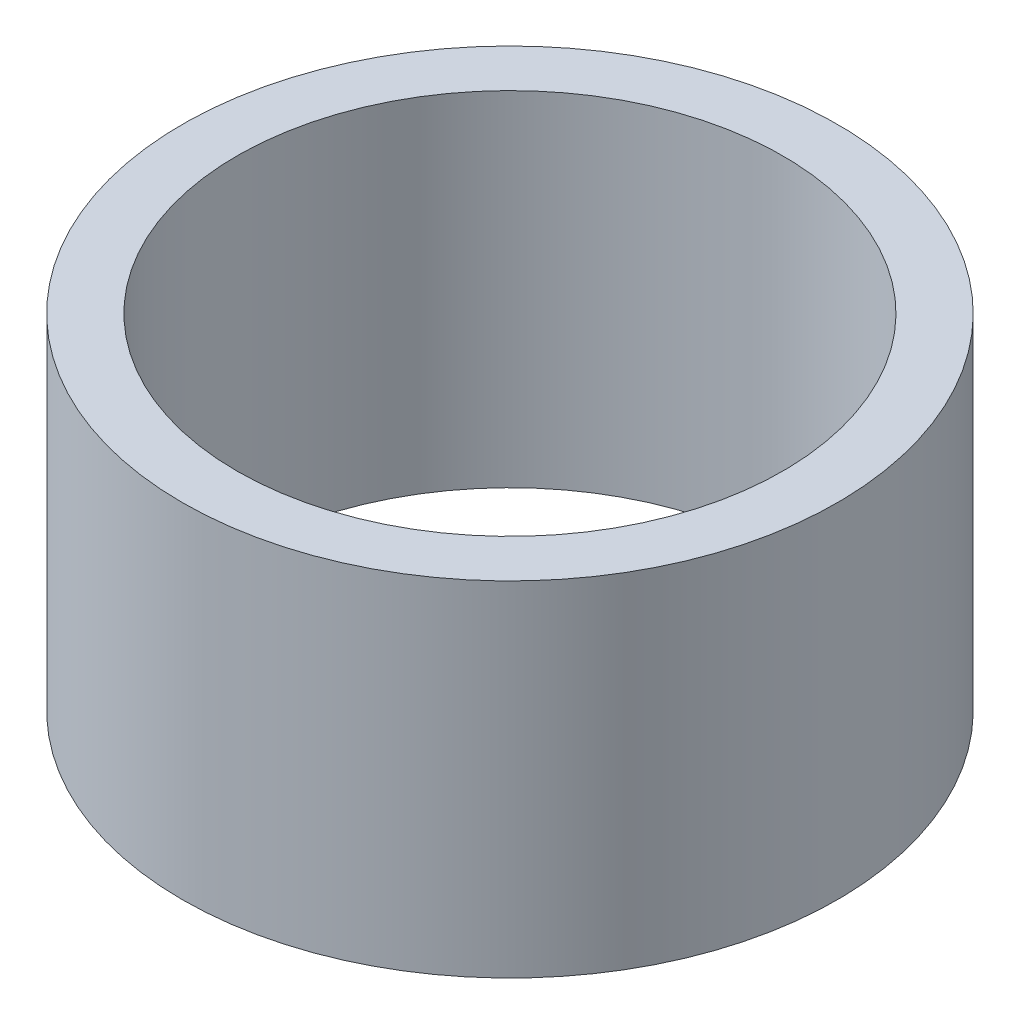
ISO-10303-21;
HEADER;
FILE_DESCRIPTION(('STEP AP214'),'2;1');
FILE_NAME('part.step','',(''),(''),'','','');
FILE_SCHEMA(('AUTOMOTIVE_DESIGN { 1 0 10303 214 1 1 1 1 }'));
ENDSEC;
DATA;
#1=APPLICATION_CONTEXT('core data for automotive mechanical design processes');
#2=APPLICATION_PROTOCOL_DEFINITION('international standard','automotive_design',2000,#1);
#3=PRODUCT_CONTEXT('',#1,'mechanical');
#4=PRODUCT('Part','Part','',(#3));
#5=PRODUCT_RELATED_PRODUCT_CATEGORY('part','',(#4));
#6=PRODUCT_DEFINITION_FORMATION('','',#4);
#7=PRODUCT_DEFINITION_CONTEXT('part definition',#1,'design');
#8=PRODUCT_DEFINITION('design','',#6,#7);
#9=PRODUCT_DEFINITION_SHAPE('','',#8);
#10=(LENGTH_UNIT() NAMED_UNIT(*) SI_UNIT(.MILLI.,.METRE.));
#11=(NAMED_UNIT(*) PLANE_ANGLE_UNIT() SI_UNIT($,.RADIAN.));
#12=(NAMED_UNIT(*) SI_UNIT($,.STERADIAN.) SOLID_ANGLE_UNIT());
#13=UNCERTAINTY_MEASURE_WITH_UNIT(LENGTH_MEASURE(1.E-05),#10,'distance_accuracy_value','');
#14=(GEOMETRIC_REPRESENTATION_CONTEXT(3) GLOBAL_UNCERTAINTY_ASSIGNED_CONTEXT((#13)) GLOBAL_UNIT_ASSIGNED_CONTEXT((#10,
#11,#12)) REPRESENTATION_CONTEXT('',''));
#15=CARTESIAN_POINT('',(0.,0.,0.));
#16=DIRECTION('',(0.,0.,1.));
#17=DIRECTION('',(1.,0.,0.));
#18=AXIS2_PLACEMENT_3D('',#15,#16,#17);
#19=CARTESIAN_POINT('',(0.,5.,0.));
#20=DIRECTION('',(0.,1.,0.));
#21=DIRECTION('',(0.,0.,1.));
#22=AXIS2_PLACEMENT_3D('',#19,#20,#21);
#23=PLANE('',#22);
#24=CARTESIAN_POINT('',(0.,5.,0.));
#25=DIRECTION('',(0.,1.,0.));
#26=DIRECTION('',(0.,0.,1.));
#27=AXIS2_PLACEMENT_3D('',#24,#25,#26);
#28=CIRCLE('',#27,4.7625);
#29=CARTESIAN_POINT('',(0.,5.,4.7625));
#30=VERTEX_POINT('',#29);
#31=EDGE_CURVE('E10',#30,#30,#28,.T.);
#32=ORIENTED_EDGE('',*,*,#31,.T.);
#33=EDGE_LOOP('',(#32));
#34=FACE_BOUND('',#33,.T.);
#35=CARTESIAN_POINT('',(0.,5.,0.));
#36=DIRECTION('',(0.,1.,0.));
#37=DIRECTION('',(0.,0.,1.));
#38=AXIS2_PLACEMENT_3D('',#35,#36,#37);
#39=CIRCLE('',#38,3.96875);
#40=CARTESIAN_POINT('',(0.,5.,3.96875));
#41=VERTEX_POINT('',#40);
#42=EDGE_CURVE('E50',#41,#41,#39,.T.);
#43=ORIENTED_EDGE('',*,*,#42,.F.);
#44=EDGE_LOOP('',(#43));
#45=FACE_BOUND('',#44,.T.);
#46=ADVANCED_FACE('F37',(#34,#45),#23,.T.);
#47=CARTESIAN_POINT('',(0.,0.,0.));
#48=DIRECTION('',(0.,1.,0.));
#49=DIRECTION('',(0.,0.,1.));
#50=AXIS2_PLACEMENT_3D('',#47,#48,#49);
#51=PLANE('',#50);
#52=CARTESIAN_POINT('',(0.,0.,0.));
#53=DIRECTION('',(0.,1.,0.));
#54=DIRECTION('',(0.,0.,1.));
#55=AXIS2_PLACEMENT_3D('',#52,#53,#54);
#56=CIRCLE('',#55,4.7625);
#57=CARTESIAN_POINT('',(0.,0.,4.7625));
#58=VERTEX_POINT('',#57);
#59=EDGE_CURVE('E41',#58,#58,#56,.T.);
#60=ORIENTED_EDGE('',*,*,#59,.F.);
#61=EDGE_LOOP('',(#60));
#62=FACE_BOUND('',#61,.T.);
#63=CARTESIAN_POINT('',(0.,0.,0.));
#64=DIRECTION('',(0.,1.,0.));
#65=DIRECTION('',(0.,0.,1.));
#66=AXIS2_PLACEMENT_3D('',#63,#64,#65);
#67=CIRCLE('',#66,3.96875);
#68=CARTESIAN_POINT('',(0.,0.,3.96875));
#69=VERTEX_POINT('',#68);
#70=EDGE_CURVE('E52',#69,#69,#67,.T.);
#71=ORIENTED_EDGE('',*,*,#70,.T.);
#72=EDGE_LOOP('',(#71));
#73=FACE_BOUND('',#72,.T.);
#74=ADVANCED_FACE('F64',(#62,#73),#51,.F.);
#75=CARTESIAN_POINT('',(0.,5.,0.));
#76=DIRECTION('',(0.,-1.,0.));
#77=DIRECTION('',(0.,0.,-1.));
#78=AXIS2_PLACEMENT_3D('',#75,#76,#77);
#79=CYLINDRICAL_SURFACE('',#78,4.7625);
#80=ORIENTED_EDGE('',*,*,#31,.F.);
#81=EDGE_LOOP('',(#80));
#82=FACE_BOUND('',#81,.T.);
#83=ORIENTED_EDGE('',*,*,#59,.T.);
#84=EDGE_LOOP('',(#83));
#85=FACE_BOUND('',#84,.T.);
#86=ADVANCED_FACE('F39',(#82,#85),#79,.T.);
#87=CARTESIAN_POINT('',(0.,5.,0.));
#88=DIRECTION('',(0.,-1.,0.));
#89=DIRECTION('',(0.,0.,-1.));
#90=AXIS2_PLACEMENT_3D('',#87,#88,#89);
#91=CYLINDRICAL_SURFACE('',#90,3.96875);
#92=ORIENTED_EDGE('',*,*,#42,.T.);
#93=EDGE_LOOP('',(#92));
#94=FACE_BOUND('',#93,.T.);
#95=ORIENTED_EDGE('',*,*,#70,.F.);
#96=EDGE_LOOP('',(#95));
#97=FACE_BOUND('',#96,.T.);
#98=ADVANCED_FACE('F60',(#94,#97),#91,.F.);
#99=CLOSED_SHELL('',(#46,#74,#86,#98));
#100=MANIFOLD_SOLID_BREP('B2',#99);
#101=ADVANCED_BREP_SHAPE_REPRESENTATION('',(#18,#100),#14);
#102=SHAPE_DEFINITION_REPRESENTATION(#9,#101);
ENDSEC;
END-ISO-10303-21;
